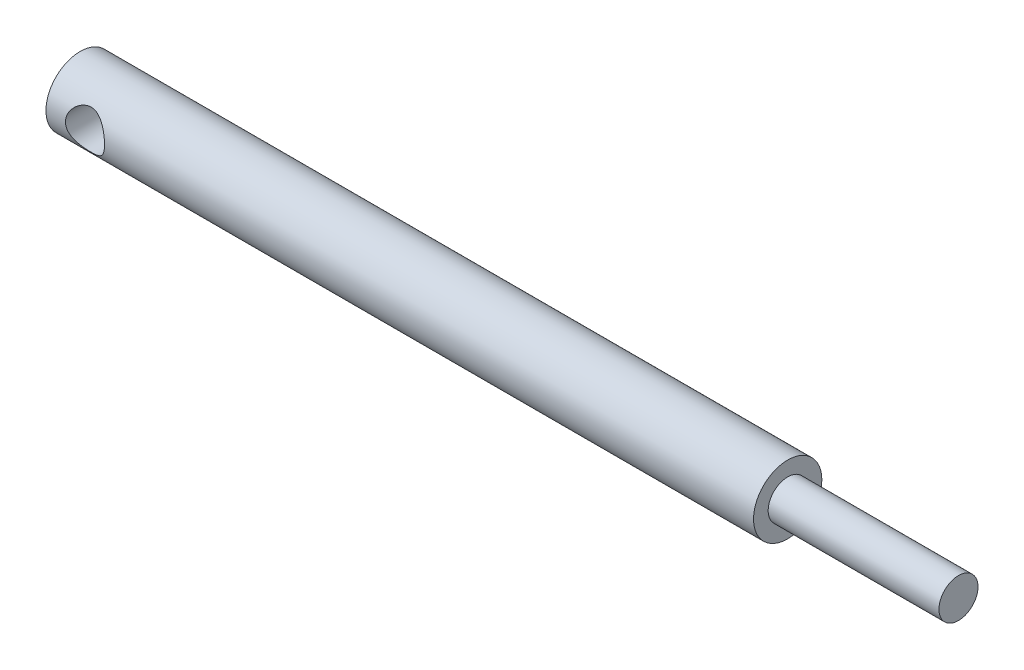
ISO-10303-21;
HEADER;
FILE_DESCRIPTION(('STEP AP214'),'2;1');
FILE_NAME('part.step','',(''),(''),'','','');
FILE_SCHEMA(('AUTOMOTIVE_DESIGN { 1 0 10303 214 1 1 1 1 }'));
ENDSEC;
DATA;
#1=APPLICATION_CONTEXT('core data for automotive mechanical design processes');
#2=APPLICATION_PROTOCOL_DEFINITION('international standard','automotive_design',2000,#1);
#3=PRODUCT_CONTEXT('',#1,'mechanical');
#4=PRODUCT('Part','Part','',(#3));
#5=PRODUCT_RELATED_PRODUCT_CATEGORY('part','',(#4));
#6=PRODUCT_DEFINITION_FORMATION('','',#4);
#7=PRODUCT_DEFINITION_CONTEXT('part definition',#1,'design');
#8=PRODUCT_DEFINITION('design','',#6,#7);
#9=PRODUCT_DEFINITION_SHAPE('','',#8);
#10=(LENGTH_UNIT() NAMED_UNIT(*) SI_UNIT(.MILLI.,.METRE.));
#11=(NAMED_UNIT(*) PLANE_ANGLE_UNIT() SI_UNIT($,.RADIAN.));
#12=(NAMED_UNIT(*) SI_UNIT($,.STERADIAN.) SOLID_ANGLE_UNIT());
#13=UNCERTAINTY_MEASURE_WITH_UNIT(LENGTH_MEASURE(1.E-05),#10,'distance_accuracy_value','');
#14=(GEOMETRIC_REPRESENTATION_CONTEXT(3) GLOBAL_UNCERTAINTY_ASSIGNED_CONTEXT((#13)) GLOBAL_UNIT_ASSIGNED_CONTEXT((#10,
#11,#12)) REPRESENTATION_CONTEXT('',''));
#15=CARTESIAN_POINT('',(0.,0.,0.));
#16=DIRECTION('',(0.,0.,1.));
#17=DIRECTION('',(1.,0.,0.));
#18=AXIS2_PLACEMENT_3D('',#15,#16,#17);
#19=CARTESIAN_POINT('',(0.,0.,0.));
#20=DIRECTION('',(1.,0.,0.));
#21=DIRECTION('',(0.,0.,-1.));
#22=AXIS2_PLACEMENT_3D('',#19,#20,#21);
#23=CYLINDRICAL_SURFACE('',#22,7.00000000000001);
#24=CARTESIAN_POINT('',(12.,0.,-7.00000000000001));
#25=CARTESIAN_POINT('',(11.9999990737785,-0.103174353693697,-6.99999916766609));
#26=CARTESIAN_POINT('',(11.9960016151889,-0.206380943793601,-6.99771279419804));
#27=CARTESIAN_POINT('',(11.9800611682758,-0.412022231403471,-6.98862259173912));
#28=CARTESIAN_POINT('',(11.9681132124003,-0.514456405807249,-6.98181593843651));
#29=CARTESIAN_POINT('',(11.9363925903525,-0.717934780638677,-6.96383614374593));
#30=CARTESIAN_POINT('',(11.9166043598707,-0.818975800015571,-6.95265431743132));
#31=CARTESIAN_POINT('',(11.869459043815,-1.01874471471558,-6.92620670688289));
#32=CARTESIAN_POINT('',(11.8420987293282,-1.11747160371512,-6.91093918050344));
#33=CARTESIAN_POINT('',(11.7494279546662,-1.40816161924452,-6.85970259630013));
#34=CARTESIAN_POINT('',(11.6733351305047,-1.59584032587964,-6.81818653388812));
#35=CARTESIAN_POINT('',(11.4953734091118,-1.95516204193538,-6.72398397587057));
#36=CARTESIAN_POINT('',(11.3935116940032,-2.12680950125059,-6.67130059340363));
#37=CARTESIAN_POINT('',(11.1586304400465,-2.46335779064466,-6.55482935189652));
#38=CARTESIAN_POINT('',(11.0238916012448,-2.62687541249465,-6.49051423222531));
#39=CARTESIAN_POINT('',(10.7308847681816,-2.93033153816757,-6.35928931111332));
#40=CARTESIAN_POINT('',(10.5725891828547,-3.07024197621332,-6.29237653599833));
#41=CARTESIAN_POINT('',(10.2166073321636,-3.33788766479094,-6.15495683988653));
#42=CARTESIAN_POINT('',(10.0165097901838,-3.46264734932395,-6.0848495947813));
#43=CARTESIAN_POINT('',(9.59409940999438,-3.67622523435091,-5.95826038292872));
#44=CARTESIAN_POINT('',(9.3718208449666,-3.76509784562975,-5.90175784209803));
#45=CARTESIAN_POINT('',(8.96170968143084,-3.88718686207776,-5.82184477812118));
#46=CARTESIAN_POINT('',(8.777136979922,-3.92836679668126,-5.79387851042932));
#47=CARTESIAN_POINT('',(8.40230052035036,-3.98421352589057,-5.75562678316026));
#48=CARTESIAN_POINT('',(8.21204308580537,-3.99890874126274,-5.74532237121863));
#49=CARTESIAN_POINT('',(7.83105065233446,-4.000975196418,-5.74388373656898));
#50=CARTESIAN_POINT('',(7.64031535601179,-3.98830912062269,-5.75277569403423));
#51=CARTESIAN_POINT('',(7.26419490598415,-3.9363298174401,-5.78845897302997));
#52=CARTESIAN_POINT('',(7.07881352495303,-3.89699825572748,-5.81526260986989));
#53=CARTESIAN_POINT('',(6.71867044985771,-3.79383546739155,-5.8830738993955));
#54=CARTESIAN_POINT('',(6.54387048559135,-3.73009950434546,-5.9240262619759));
#55=CARTESIAN_POINT('',(6.2068991376122,-3.58033837481382,-6.01571820888124));
#56=CARTESIAN_POINT('',(6.04473261660828,-3.49430468035282,-6.06646153595045));
#57=CARTESIAN_POINT('',(5.71005921955256,-3.28648201894193,-6.18185421346709));
#58=CARTESIAN_POINT('',(5.54005980594646,-3.16117260883959,-6.24742890906938));
#59=CARTESIAN_POINT('',(5.2218112543961,-2.88547978627878,-6.37944698360957));
#60=CARTESIAN_POINT('',(5.07358086125987,-2.73507500002896,-6.44589105816035));
#61=CARTESIAN_POINT('',(4.8620010098305,-2.48331031323022,-6.54542571666138));
#62=CARTESIAN_POINT('',(4.79011168914788,-2.38969010220766,-6.58026752098846));
#63=CARTESIAN_POINT('',(4.65453429847005,-2.19586698303154,-6.64745587466659));
#64=CARTESIAN_POINT('',(4.59084290638017,-2.09566676634965,-6.67980343263157));
#65=CARTESIAN_POINT('',(4.47224099507144,-1.88920400254899,-6.74110581212485));
#66=CARTESIAN_POINT('',(4.41733072263962,-1.78294128516184,-6.77006053829396));
#67=CARTESIAN_POINT('',(4.31694589929958,-1.5650825805267,-6.8237151038038));
#68=CARTESIAN_POINT('',(4.2714656278025,-1.45348987750211,-6.84841752119957));
#69=CARTESIAN_POINT('',(4.1933006852081,-1.23357577903308,-6.89129649283954));
#70=CARTESIAN_POINT('',(4.15995233623311,-1.12555499053735,-6.90980443827148));
#71=CARTESIAN_POINT('',(4.10241384078455,-0.906444721241708,-6.94194552986213));
#72=CARTESIAN_POINT('',(4.07821875975136,-0.795356928634558,-6.95558130240597));
#73=CARTESIAN_POINT('',(4.03934119893274,-0.57107602160654,-6.97757559140466));
#74=CARTESIAN_POINT('',(4.02465329347613,-0.457884145982388,-6.9859371177612));
#75=CARTESIAN_POINT('',(4.00500942529191,-0.230391688469546,-6.99713394609542));
#76=CARTESIAN_POINT('',(4.00005237318067,-0.116091232128078,-6.99996986667268));
#77=CARTESIAN_POINT('',(3.99995475385775,0.0985985157551666,-7.00002603570935));
#78=CARTESIAN_POINT('',(4.00369380387183,0.198989300897793,-6.99788721407677));
#79=CARTESIAN_POINT('',(4.0186911786769,0.399056378144496,-6.98933343073186));
#80=CARTESIAN_POINT('',(4.02995185462434,0.498732436984942,-6.98291713194042));
#81=CARTESIAN_POINT('',(4.05985003457538,0.696577503138314,-6.96596218341933));
#82=CARTESIAN_POINT('',(4.07848466908657,0.794747081263251,-6.9554251372505));
#83=CARTESIAN_POINT('',(4.12290229729652,0.988966675044403,-6.93048013582529));
#84=CARTESIAN_POINT('',(4.14868804735565,1.08501585796257,-6.91607068803825));
#85=CARTESIAN_POINT('',(4.23574821092044,1.36702487624933,-6.86784025244504));
#86=CARTESIAN_POINT('',(4.30707615590975,1.54910864022513,-6.82881174027117));
#87=CARTESIAN_POINT('',(4.47403713743114,1.89874210569062,-6.73998795964162));
#88=CARTESIAN_POINT('',(4.56967602590037,2.06628829476745,-6.69019009930532));
#89=CARTESIAN_POINT('',(4.7937859285204,2.40101022734591,-6.57794997192014));
#90=CARTESIAN_POINT('',(4.92463820468405,2.5663321281279,-6.51473109707347));
#91=CARTESIAN_POINT('',(5.20992379443006,2.87394702055109,-6.38501165185069));
#92=CARTESIAN_POINT('',(5.36438408767189,3.01621327559794,-6.31850738648144));
#93=CARTESIAN_POINT('',(5.71280490023981,3.28985374296218,-6.18084352273241));
#94=CARTESIAN_POINT('',(5.90924955818289,3.41824351694382,-6.10999195942494));
#95=CARTESIAN_POINT('',(6.32470930178022,3.63986774300697,-5.98062693471644));
#96=CARTESIAN_POINT('',(6.54369389450429,3.73314891565778,-5.92209712227824));
#97=CARTESIAN_POINT('',(6.95047052116575,3.86444214295347,-5.83702467135121));
#98=CARTESIAN_POINT('',(7.13495298168565,3.90999905451075,-5.80632211246575));
#99=CARTESIAN_POINT('',(7.51046818506406,3.9744867486248,-5.76238064526143));
#100=CARTESIAN_POINT('',(7.70149322026468,3.99344782797955,-5.74912186682824));
#101=CARTESIAN_POINT('',(8.08504554507146,4.00370381772298,-5.74198624338645));
#102=CARTESIAN_POINT('',(8.27757508284239,3.99494302763229,-5.74814842005173));
#103=CARTESIAN_POINT('',(8.65795427962015,3.95016772474908,-5.7790027926468));
#104=CARTESIAN_POINT('',(8.84580090104658,3.91413597452469,-5.80370670835906));
#105=CARTESIAN_POINT('',(9.20875134639438,3.81754070421715,-5.867676189417));
#106=CARTESIAN_POINT('',(9.38401941400973,3.75741242514336,-5.90668241023304));
#107=CARTESIAN_POINT('',(9.72239789386605,3.61484445738468,-5.99499093748337));
#108=CARTESIAN_POINT('',(9.88550379452539,3.53239654118207,-6.04429703915075));
#109=CARTESIAN_POINT('',(10.2216879471774,3.33286050522201,-6.15687101376708));
#110=CARTESIAN_POINT('',(10.3924342843469,3.21239325811871,-6.2211196730876));
#111=CARTESIAN_POINT('',(10.7129101395508,2.94678350974006,-6.3512524855134));
#112=CARTESIAN_POINT('',(10.8626212172251,2.8016196017693,-6.41713801476202));
#113=CARTESIAN_POINT('',(11.1557430776657,2.46904766832848,-6.55284552282305));
#114=CARTESIAN_POINT('',(11.296050191174,2.27863050588136,-6.62213671268149));
#115=CARTESIAN_POINT('',(11.4806295570055,1.97466957376766,-6.71654843840248));
#116=CARTESIAN_POINT('',(11.5378572293742,1.87025550480295,-6.74643988436932));
#117=CARTESIAN_POINT('',(11.6431286222118,1.65585314541164,-6.8022337705049));
#118=CARTESIAN_POINT('',(11.6911748729057,1.54586640130945,-6.8281373092814));
#119=CARTESIAN_POINT('',(11.7697722619568,1.34112548315163,-6.87097539991197));
#120=CARTESIAN_POINT('',(11.8019151507417,1.24713982863983,-6.88868575445999));
#121=CARTESIAN_POINT('',(11.8592432185437,1.05647742318426,-6.92049045413033));
#122=CARTESIAN_POINT('',(11.8844296281074,0.959801151524304,-6.93458543875171));
#123=CARTESIAN_POINT('',(11.9275116570702,0.76460408313232,-6.9588096346455));
#124=CARTESIAN_POINT('',(11.9454250750511,0.666088414047025,-6.9689485249349));
#125=CARTESIAN_POINT('',(11.9738259509329,0.46769427978604,-6.98506655367339));
#126=CARTESIAN_POINT('',(11.9843176335827,0.367816622968022,-6.99104805863875));
#127=CARTESIAN_POINT('',(11.9940222684482,0.223113454646563,-6.99658555791356));
#128=CARTESIAN_POINT('',(11.9962629772696,0.178534436572898,-6.99786511874743));
#129=CARTESIAN_POINT('',(11.9992521217612,0.0893056299289608,-6.99957256458766));
#130=CARTESIAN_POINT('',(12.0000004008864,0.0446558344261973,-7.00000036025006));
#131=CARTESIAN_POINT('',(12.,0.,-7.00000000000001));
#132=B_SPLINE_CURVE_WITH_KNOTS('',3,(#24,#25,#26,#27,#28,#29,#30,#31,#32,#33,#34,#35,#36,#37,
#38,#39,#40,#41,#42,#43,#44,#45,#46,#47,#48,#49,#50,#51,#52,#53,#54,#55,#56,#57,#58,#59,#60,#61,
#62,#63,#64,#65,#66,#67,#68,#69,#70,#71,#72,#73,#74,#75,#76,#77,#78,#79,#80,#81,#82,#83,#84,#85,
#86,#87,#88,#89,#90,#91,#92,#93,#94,#95,#96,#97,#98,#99,#100,#101,#102,#103,#104,#105,#106,#107,
#108,#109,#110,#111,#112,#113,#114,#115,#116,#117,#118,#119,#120,#121,#122,#123,#124,#125,#126,
#127,#128,#129,#130,#131),.UNSPECIFIED.,.T.,.F.,(4,2,2,2,2,2,2,2,2,2,2,2,2,2,2,2,2,2,2,2,2,2,2,
2,2,2,2,2,2,2,2,2,2,2,2,2,2,2,2,2,2,2,2,2,2,2,2,2,2,2,2,2,2,4),(0.,0.309476324047613,
0.619146193855395,0.929433917393154,1.23985415925134,1.85706150441802,2.47409701507639,
3.13570852611814,3.79810114556277,4.53248005222481,5.26574129924114,5.83676638409032,
6.40717833593582,6.97836871188834,7.54995221869044,8.11932690485233,8.68891967585259,
9.34979048117591,10.0112270520965,10.3800420446255,10.7487071063677,11.1173825273551,
11.4858336375217,11.829013046234,12.172007181154,12.5148053990004,12.8575652378825,
13.1586456412119,13.4598202021895,13.7608776795699,14.0620513596592,14.6575858081394,
15.2532637449137,15.910945217437,16.5693839988404,17.3012585698566,18.0321557302083,
18.6071545432669,19.1814978096213,19.7569958138958,20.3328578831257,20.898756255232,
21.4648635148624,22.118143381826,22.7719924141757,23.5072264951885,23.87508904646,
24.2428500751504,24.5452250849504,24.8475465726778,25.1491236891176,25.4505289973437,
25.5844622240579,25.7184094986541),.UNSPECIFIED.);
#133=CARTESIAN_POINT('',(12.,0.,-7.00000000000001));
#134=VERTEX_POINT('',#133);
#135=EDGE_CURVE('E10',#134,#134,#132,.T.);
#136=ORIENTED_EDGE('',*,*,#135,.F.);
#137=EDGE_LOOP('',(#136));
#138=FACE_BOUND('',#137,.T.);
#139=CARTESIAN_POINT('',(12.,0.,7.00000000000002));
#140=CARTESIAN_POINT('',(11.9999990737785,0.103174353693696,6.9999991676661));
#141=CARTESIAN_POINT('',(11.9960016151889,0.206380943793601,6.99771279419804));
#142=CARTESIAN_POINT('',(11.9800611682758,0.41202223140347,6.98862259173911));
#143=CARTESIAN_POINT('',(11.9681132124003,0.514456405807249,6.98181593843651));
#144=CARTESIAN_POINT('',(11.9363925903525,0.717934780638677,6.96383614374593));
#145=CARTESIAN_POINT('',(11.9166043598707,0.818975800015571,6.95265431743132));
#146=CARTESIAN_POINT('',(11.869459043815,1.01874471471558,6.92620670688288));
#147=CARTESIAN_POINT('',(11.8420987293282,1.11747160371512,6.91093918050344));
#148=CARTESIAN_POINT('',(11.7494279546662,1.40816161924453,6.85970259630013));
#149=CARTESIAN_POINT('',(11.6733351305047,1.59584032587964,6.81818653388812));
#150=CARTESIAN_POINT('',(11.4953734091118,1.95516204193538,6.72398397587057));
#151=CARTESIAN_POINT('',(11.3935116940032,2.12680950125059,6.67130059340363));
#152=CARTESIAN_POINT('',(11.1586304400465,2.46335779064466,6.55482935189652));
#153=CARTESIAN_POINT('',(11.0238916012448,2.62687541249465,6.49051423222531));
#154=CARTESIAN_POINT('',(10.7308847681816,2.93033153816757,6.35928931111332));
#155=CARTESIAN_POINT('',(10.5725891828547,3.07024197621332,6.29237653599833));
#156=CARTESIAN_POINT('',(10.2166073321636,3.33788766479094,6.15495683988653));
#157=CARTESIAN_POINT('',(10.0165097901838,3.46264734932395,6.0848495947813));
#158=CARTESIAN_POINT('',(9.59409940999438,3.67622523435091,5.95826038292872));
#159=CARTESIAN_POINT('',(9.3718208449666,3.76509784562975,5.90175784209802));
#160=CARTESIAN_POINT('',(8.96170968143084,3.88718686207776,5.82184477812118));
#161=CARTESIAN_POINT('',(8.777136979922,3.92836679668126,5.79387851042932));
#162=CARTESIAN_POINT('',(8.40230052035036,3.98421352589057,5.75562678316026));
#163=CARTESIAN_POINT('',(8.21204308580537,3.99890874126274,5.74532237121863));
#164=CARTESIAN_POINT('',(7.83105065233446,4.000975196418,5.74388373656898));
#165=CARTESIAN_POINT('',(7.64031535601179,3.98830912062269,5.75277569403423));
#166=CARTESIAN_POINT('',(7.26419490598415,3.9363298174401,5.78845897302997));
#167=CARTESIAN_POINT('',(7.07881352495303,3.89699825572748,5.81526260986989));
#168=CARTESIAN_POINT('',(6.71867044985771,3.79383546739155,5.8830738993955));
#169=CARTESIAN_POINT('',(6.54387048559135,3.73009950434546,5.9240262619759));
#170=CARTESIAN_POINT('',(6.2068991376122,3.58033837481382,6.01571820888124));
#171=CARTESIAN_POINT('',(6.04473261660827,3.49430468035282,6.06646153595045));
#172=CARTESIAN_POINT('',(5.71005921955256,3.28648201894193,6.18185421346709));
#173=CARTESIAN_POINT('',(5.54005980594646,3.16117260883959,6.24742890906938));
#174=CARTESIAN_POINT('',(5.2218112543961,2.88547978627878,6.37944698360957));
#175=CARTESIAN_POINT('',(5.07358086125987,2.73507500002896,6.44589105816036));
#176=CARTESIAN_POINT('',(4.8620010098305,2.48331031323022,6.54542571666139));
#177=CARTESIAN_POINT('',(4.79011168914787,2.38969010220766,6.58026752098846));
#178=CARTESIAN_POINT('',(4.65453429847005,2.19586698303154,6.64745587466659));
#179=CARTESIAN_POINT('',(4.59084290638017,2.09566676634965,6.67980343263157));
#180=CARTESIAN_POINT('',(4.47224099507144,1.88920400254898,6.74110581212485));
#181=CARTESIAN_POINT('',(4.41733072263962,1.78294128516184,6.77006053829396));
#182=CARTESIAN_POINT('',(4.31694589929957,1.5650825805267,6.8237151038038));
#183=CARTESIAN_POINT('',(4.2714656278025,1.45348987750211,6.84841752119957));
#184=CARTESIAN_POINT('',(4.1933006852081,1.23357577903308,6.89129649283954));
#185=CARTESIAN_POINT('',(4.15995233623311,1.12555499053735,6.90980443827148));
#186=CARTESIAN_POINT('',(4.10241384078455,0.906444721241707,6.94194552986213));
#187=CARTESIAN_POINT('',(4.07821875975136,0.795356928634558,6.95558130240597));
#188=CARTESIAN_POINT('',(4.03934119893274,0.571076021606539,6.97757559140466));
#189=CARTESIAN_POINT('',(4.02465329347612,0.457884145982386,6.9859371177612));
#190=CARTESIAN_POINT('',(4.00500942529191,0.230391688469543,6.99713394609542));
#191=CARTESIAN_POINT('',(4.00005237318067,0.116091232128076,6.99996986667268));
#192=CARTESIAN_POINT('',(3.99995475385775,-0.0985985157551687,7.00002603570935));
#193=CARTESIAN_POINT('',(4.00369380387183,-0.198989300897795,6.99788721407677));
#194=CARTESIAN_POINT('',(4.0186911786769,-0.399056378144497,6.98933343073185));
#195=CARTESIAN_POINT('',(4.02995185462434,-0.498732436984944,6.98291713194042));
#196=CARTESIAN_POINT('',(4.05985003457538,-0.696577503138315,6.96596218341933));
#197=CARTESIAN_POINT('',(4.07848466908657,-0.794747081263252,6.9554251372505));
#198=CARTESIAN_POINT('',(4.12290229729652,-0.988966675044404,6.93048013582528));
#199=CARTESIAN_POINT('',(4.14868804735565,-1.08501585796257,6.91607068803825));
#200=CARTESIAN_POINT('',(4.23574821092044,-1.36702487624934,6.86784025244504));
#201=CARTESIAN_POINT('',(4.30707615590975,-1.54910864022514,6.82881174027117));
#202=CARTESIAN_POINT('',(4.47403713743114,-1.89874210569063,6.73998795964162));
#203=CARTESIAN_POINT('',(4.56967602590037,-2.06628829476745,6.69019009930532));
#204=CARTESIAN_POINT('',(4.7937859285204,-2.40101022734591,6.57794997192014));
#205=CARTESIAN_POINT('',(4.92463820468406,-2.5663321281279,6.51473109707347));
#206=CARTESIAN_POINT('',(5.20992379443006,-2.87394702055109,6.38501165185069));
#207=CARTESIAN_POINT('',(5.36438408767189,-3.01621327559794,6.31850738648144));
#208=CARTESIAN_POINT('',(5.71280490023981,-3.28985374296219,6.18084352273241));
#209=CARTESIAN_POINT('',(5.9092495581829,-3.41824351694382,6.10999195942494));
#210=CARTESIAN_POINT('',(6.32470930178023,-3.63986774300697,5.98062693471644));
#211=CARTESIAN_POINT('',(6.5436938945043,-3.73314891565778,5.92209712227824));
#212=CARTESIAN_POINT('',(6.95047052116576,-3.86444214295347,5.8370246713512));
#213=CARTESIAN_POINT('',(7.13495298168565,-3.90999905451075,5.80632211246575));
#214=CARTESIAN_POINT('',(7.51046818506406,-3.9744867486248,5.76238064526143));
#215=CARTESIAN_POINT('',(7.70149322026468,-3.99344782797955,5.74912186682824));
#216=CARTESIAN_POINT('',(8.08504554507146,-4.00370381772298,5.74198624338645));
#217=CARTESIAN_POINT('',(8.27757508284239,-3.99494302763229,5.74814842005173));
#218=CARTESIAN_POINT('',(8.65795427962015,-3.95016772474908,5.7790027926468));
#219=CARTESIAN_POINT('',(8.84580090104658,-3.91413597452469,5.80370670835906));
#220=CARTESIAN_POINT('',(9.20875134639438,-3.81754070421715,5.867676189417));
#221=CARTESIAN_POINT('',(9.38401941400972,-3.75741242514336,5.90668241023304));
#222=CARTESIAN_POINT('',(9.72239789386604,-3.61484445738468,5.99499093748337));
#223=CARTESIAN_POINT('',(9.88550379452539,-3.53239654118207,6.04429703915075));
#224=CARTESIAN_POINT('',(10.2216879471774,-3.33286050522201,6.15687101376708));
#225=CARTESIAN_POINT('',(10.3924342843469,-3.21239325811871,6.2211196730876));
#226=CARTESIAN_POINT('',(10.7129101395507,-2.94678350974006,6.3512524855134));
#227=CARTESIAN_POINT('',(10.8626212172251,-2.80161960176931,6.41713801476201));
#228=CARTESIAN_POINT('',(11.1557430776657,-2.46904766832849,6.55284552282305));
#229=CARTESIAN_POINT('',(11.296050191174,-2.27863050588136,6.62213671268149));
#230=CARTESIAN_POINT('',(11.4806295570055,-1.97466957376766,6.71654843840248));
#231=CARTESIAN_POINT('',(11.5378572293742,-1.87025550480295,6.74643988436932));
#232=CARTESIAN_POINT('',(11.6431286222117,-1.65585314541164,6.80223377050489));
#233=CARTESIAN_POINT('',(11.6911748729057,-1.54586640130945,6.8281373092814));
#234=CARTESIAN_POINT('',(11.7697722619568,-1.34112548315163,6.87097539991197));
#235=CARTESIAN_POINT('',(11.8019151507417,-1.24713982863984,6.88868575445999));
#236=CARTESIAN_POINT('',(11.8592432185437,-1.05647742318427,6.92049045413033));
#237=CARTESIAN_POINT('',(11.8844296281074,-0.959801151524308,6.93458543875171));
#238=CARTESIAN_POINT('',(11.9275116570702,-0.764604083132324,6.9588096346455));
#239=CARTESIAN_POINT('',(11.9454250750511,-0.666088414047029,6.9689485249349));
#240=CARTESIAN_POINT('',(11.9738259509329,-0.467694279786044,6.98506655367339));
#241=CARTESIAN_POINT('',(11.9843176335827,-0.367816622968026,6.99104805863875));
#242=CARTESIAN_POINT('',(11.9940222684482,-0.223113454646567,6.99658555791356));
#243=CARTESIAN_POINT('',(11.9962629772696,-0.178534436572902,6.99786511874743));
#244=CARTESIAN_POINT('',(11.9992521217612,-0.0893056299289634,6.99957256458767));
#245=CARTESIAN_POINT('',(12.0000004008864,-0.0446558344261986,7.00000036025006));
#246=CARTESIAN_POINT('',(12.,0.,7.00000000000002));
#247=B_SPLINE_CURVE_WITH_KNOTS('',3,(#139,#140,#141,#142,#143,#144,#145,#146,#147,#148,#149,
#150,#151,#152,#153,#154,#155,#156,#157,#158,#159,#160,#161,#162,#163,#164,#165,#166,#167,#168,
#169,#170,#171,#172,#173,#174,#175,#176,#177,#178,#179,#180,#181,#182,#183,#184,#185,#186,#187,
#188,#189,#190,#191,#192,#193,#194,#195,#196,#197,#198,#199,#200,#201,#202,#203,#204,#205,#206,
#207,#208,#209,#210,#211,#212,#213,#214,#215,#216,#217,#218,#219,#220,#221,#222,#223,#224,#225,
#226,#227,#228,#229,#230,#231,#232,#233,#234,#235,#236,#237,#238,#239,#240,#241,#242,#243,#244,
#245,#246),.UNSPECIFIED.,.T.,.F.,(4,2,2,2,2,2,2,2,2,2,2,2,2,2,2,2,2,2,2,2,2,2,2,2,2,2,2,2,2,2,2,
2,2,2,2,2,2,2,2,2,2,2,2,2,2,2,2,2,2,2,2,2,2,4),(0.,0.309476324047612,0.619146193855395,
0.929433917393154,1.23985415925134,1.85706150441802,2.47409701507639,3.13570852611814,
3.79810114556278,4.53248005222481,5.26574129924114,5.83676638409032,6.40717833593582,
6.97836871188834,7.54995221869044,8.11932690485233,8.68891967585259,9.34979048117591,
10.0112270520965,10.3800420446256,10.7487071063677,11.1173825273551,11.4858336375217,
11.829013046234,12.172007181154,12.5148053990004,12.8575652378825,13.1586456412119,
13.4598202021895,13.7608776795699,14.0620513596592,14.6575858081394,15.2532637449138,
15.910945217437,16.5693839988404,17.3012585698566,18.0321557302083,18.6071545432669,
19.1814978096213,19.7569958138958,20.3328578831257,20.898756255232,21.4648635148624,
22.118143381826,22.7719924141757,23.5072264951885,23.87508904646,24.2428500751504,
24.5452250849504,24.8475465726778,25.1491236891176,25.4505289973437,25.5844622240579,
25.7184094986541),.UNSPECIFIED.);
#248=CARTESIAN_POINT('',(12.,0.,7.00000000000002));
#249=VERTEX_POINT('',#248);
#250=EDGE_CURVE('E41',#249,#249,#247,.T.);
#251=ORIENTED_EDGE('',*,*,#250,.F.);
#252=EDGE_LOOP('',(#251));
#253=FACE_BOUND('',#252,.T.);
#254=CARTESIAN_POINT('',(0.,0.,0.));
#255=DIRECTION('',(1.,0.,0.));
#256=DIRECTION('',(0.,0.,-1.));
#257=AXIS2_PLACEMENT_3D('',#254,#255,#256);
#258=CIRCLE('',#257,7.00000000000002);
#259=CARTESIAN_POINT('',(0.,0.,-7.00000000000002));
#260=VERTEX_POINT('',#259);
#261=EDGE_CURVE('E45',#260,#260,#258,.T.);
#262=ORIENTED_EDGE('',*,*,#261,.T.);
#263=EDGE_LOOP('',(#262));
#264=FACE_BOUND('',#263,.T.);
#265=CARTESIAN_POINT('',(145.,0.,0.));
#266=DIRECTION('',(1.,0.,0.));
#267=DIRECTION('',(0.,0.,-1.));
#268=AXIS2_PLACEMENT_3D('',#265,#266,#267);
#269=CIRCLE('',#268,7.);
#270=CARTESIAN_POINT('',(145.,0.,-7.));
#271=VERTEX_POINT('',#270);
#272=EDGE_CURVE('E83',#271,#271,#269,.T.);
#273=ORIENTED_EDGE('',*,*,#272,.F.);
#274=EDGE_LOOP('',(#273));
#275=FACE_BOUND('',#274,.T.);
#276=ADVANCED_FACE('F30',(#138,#253,#264,#275),#23,.T.);
#277=CARTESIAN_POINT('',(0.,7.00000000000002,0.));
#278=DIRECTION('',(-1.,0.,0.));
#279=DIRECTION('',(0.,0.,1.));
#280=AXIS2_PLACEMENT_3D('',#277,#278,#279);
#281=PLANE('',#280);
#282=ORIENTED_EDGE('',*,*,#261,.F.);
#283=EDGE_LOOP('',(#282));
#284=FACE_BOUND('',#283,.T.);
#285=ADVANCED_FACE('F70',(#284),#281,.T.);
#286=CARTESIAN_POINT('',(180.,0.,0.));
#287=DIRECTION('',(1.,0.,0.));
#288=DIRECTION('',(0.,0.,-1.));
#289=AXIS2_PLACEMENT_3D('',#286,#287,#288);
#290=PLANE('',#289);
#291=CARTESIAN_POINT('',(180.,0.,0.));
#292=DIRECTION('',(1.,0.,0.));
#293=DIRECTION('',(0.,0.,-1.));
#294=AXIS2_PLACEMENT_3D('',#291,#292,#293);
#295=CIRCLE('',#294,4.);
#296=CARTESIAN_POINT('',(180.,0.,-4.));
#297=VERTEX_POINT('',#296);
#298=EDGE_CURVE('E49',#297,#297,#295,.T.);
#299=ORIENTED_EDGE('',*,*,#298,.T.);
#300=EDGE_LOOP('',(#299));
#301=FACE_BOUND('',#300,.T.);
#302=ADVANCED_FACE('F67',(#301),#290,.T.);
#303=CARTESIAN_POINT('',(0.,0.,0.));
#304=DIRECTION('',(1.,0.,0.));
#305=DIRECTION('',(0.,0.,-1.));
#306=AXIS2_PLACEMENT_3D('',#303,#304,#305);
#307=CYLINDRICAL_SURFACE('',#306,4.);
#308=CARTESIAN_POINT('',(145.,0.,0.));
#309=DIRECTION('',(1.,0.,0.));
#310=DIRECTION('',(0.,0.,-1.));
#311=AXIS2_PLACEMENT_3D('',#308,#309,#310);
#312=CIRCLE('',#311,4.);
#313=CARTESIAN_POINT('',(145.,0.,-4.));
#314=VERTEX_POINT('',#313);
#315=EDGE_CURVE('E84',#314,#314,#312,.T.);
#316=ORIENTED_EDGE('',*,*,#315,.T.);
#317=EDGE_LOOP('',(#316));
#318=FACE_BOUND('',#317,.T.);
#319=ORIENTED_EDGE('',*,*,#298,.F.);
#320=EDGE_LOOP('',(#319));
#321=FACE_BOUND('',#320,.T.);
#322=ADVANCED_FACE('F63',(#318,#321),#307,.T.);
#323=CARTESIAN_POINT('',(145.,4.,0.));
#324=DIRECTION('',(1.,0.,0.));
#325=DIRECTION('',(0.,0.,-1.));
#326=AXIS2_PLACEMENT_3D('',#323,#324,#325);
#327=PLANE('',#326);
#328=ORIENTED_EDGE('',*,*,#272,.T.);
#329=EDGE_LOOP('',(#328));
#330=FACE_BOUND('',#329,.T.);
#331=ORIENTED_EDGE('',*,*,#315,.F.);
#332=EDGE_LOOP('',(#331));
#333=FACE_BOUND('',#332,.T.);
#334=ADVANCED_FACE('F59',(#330,#333),#327,.T.);
#335=CARTESIAN_POINT('',(8.00000000000001,0.,-7.00000000000002));
#336=DIRECTION('',(0.,0.,1.));
#337=DIRECTION('',(1.,0.,0.));
#338=AXIS2_PLACEMENT_3D('',#335,#336,#337);
#339=CYLINDRICAL_SURFACE('',#338,3.99999999999999);
#340=ORIENTED_EDGE('',*,*,#135,.T.);
#341=EDGE_LOOP('',(#340));
#342=FACE_BOUND('',#341,.T.);
#343=ORIENTED_EDGE('',*,*,#250,.T.);
#344=EDGE_LOOP('',(#343));
#345=FACE_BOUND('',#344,.T.);
#346=ADVANCED_FACE('F55',(#342,#345),#339,.F.);
#347=CLOSED_SHELL('',(#276,#285,#302,#322,#334,#346));
#348=MANIFOLD_SOLID_BREP('B2',#347);
#349=ADVANCED_BREP_SHAPE_REPRESENTATION('',(#18,#348),#14);
#350=SHAPE_DEFINITION_REPRESENTATION(#9,#349);
ENDSEC;
END-ISO-10303-21;
